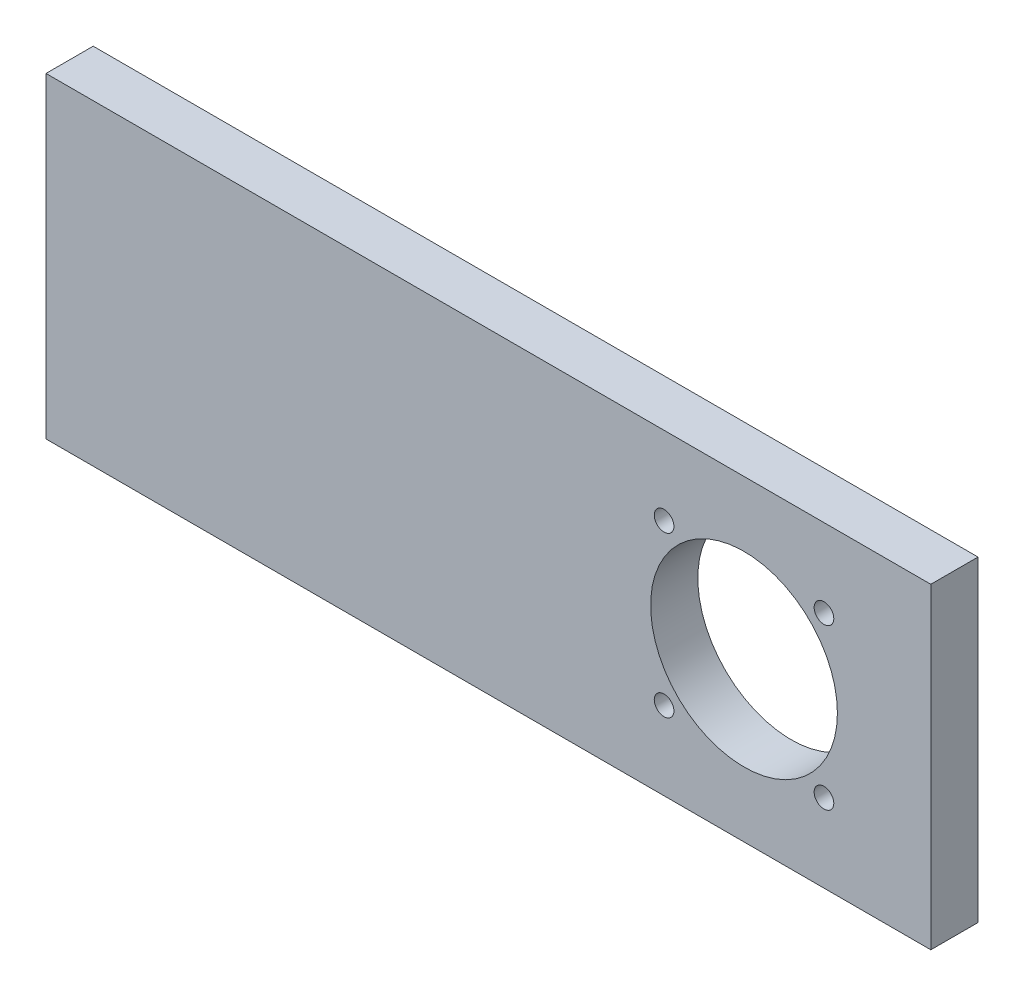
ISO-10303-21;
HEADER;
FILE_DESCRIPTION(('STEP AP214'),'2;1');
FILE_NAME('part.step','',(''),(''),'','','');
FILE_SCHEMA(('AUTOMOTIVE_DESIGN { 1 0 10303 214 1 1 1 1 }'));
ENDSEC;
DATA;
#1=APPLICATION_CONTEXT('core data for automotive mechanical design processes');
#2=APPLICATION_PROTOCOL_DEFINITION('international standard','automotive_design',2000,#1);
#3=PRODUCT_CONTEXT('',#1,'mechanical');
#4=PRODUCT('Part','Part','',(#3));
#5=PRODUCT_RELATED_PRODUCT_CATEGORY('part','',(#4));
#6=PRODUCT_DEFINITION_FORMATION('','',#4);
#7=PRODUCT_DEFINITION_CONTEXT('part definition',#1,'design');
#8=PRODUCT_DEFINITION('design','',#6,#7);
#9=PRODUCT_DEFINITION_SHAPE('','',#8);
#10=(LENGTH_UNIT() NAMED_UNIT(*) SI_UNIT(.MILLI.,.METRE.));
#11=(NAMED_UNIT(*) PLANE_ANGLE_UNIT() SI_UNIT($,.RADIAN.));
#12=(NAMED_UNIT(*) SI_UNIT($,.STERADIAN.) SOLID_ANGLE_UNIT());
#13=UNCERTAINTY_MEASURE_WITH_UNIT(LENGTH_MEASURE(1.E-05),#10,'distance_accuracy_value','');
#14=(GEOMETRIC_REPRESENTATION_CONTEXT(3) GLOBAL_UNCERTAINTY_ASSIGNED_CONTEXT((#13)) GLOBAL_UNIT_ASSIGNED_CONTEXT((#10,
#11,#12)) REPRESENTATION_CONTEXT('',''));
#15=CARTESIAN_POINT('',(0.,0.,0.));
#16=DIRECTION('',(0.,0.,1.));
#17=DIRECTION('',(1.,0.,0.));
#18=AXIS2_PLACEMENT_3D('',#15,#16,#17);
#19=CARTESIAN_POINT('',(0.,0.,24.));
#20=DIRECTION('',(0.,0.,-1.));
#21=DIRECTION('',(-1.,0.,0.));
#22=AXIS2_PLACEMENT_3D('',#19,#20,#21);
#23=PLANE('',#22);
#24=CARTESIAN_POINT('',(89.3413600817735,-40.6586399182264,24.));
#25=DIRECTION('',(0.,0.,-1.));
#26=DIRECTION('',(-1.,0.,0.));
#27=AXIS2_PLACEMENT_3D('',#24,#25,#26);
#28=CIRCLE('',#27,5.00000000000003);
#29=CARTESIAN_POINT('',(84.3413600817734,-40.6586399182264,24.));
#30=VERTEX_POINT('',#29);
#31=EDGE_CURVE('E181',#30,#30,#28,.T.);
#32=ORIENTED_EDGE('',*,*,#31,.T.);
#33=EDGE_LOOP('',(#32));
#34=FACE_BOUND('',#33,.T.);
#35=CARTESIAN_POINT('',(170.658639918226,-40.6586399182266,24.));
#36=DIRECTION('',(0.,0.,-1.));
#37=DIRECTION('',(-1.,0.,0.));
#38=AXIS2_PLACEMENT_3D('',#35,#36,#37);
#39=CIRCLE('',#38,5.00000000000002);
#40=CARTESIAN_POINT('',(165.658639918226,-40.6586399182266,24.));
#41=VERTEX_POINT('',#40);
#42=EDGE_CURVE('E186',#41,#41,#39,.T.);
#43=ORIENTED_EDGE('',*,*,#42,.T.);
#44=EDGE_LOOP('',(#43));
#45=FACE_BOUND('',#44,.T.);
#46=CARTESIAN_POINT('',(170.658639918227,40.6586399182264,24.));
#47=DIRECTION('',(0.,0.,-1.));
#48=DIRECTION('',(-1.,0.,0.));
#49=AXIS2_PLACEMENT_3D('',#46,#47,#48);
#50=CIRCLE('',#49,4.99999999999999);
#51=CARTESIAN_POINT('',(165.658639918227,40.6586399182264,24.));
#52=VERTEX_POINT('',#51);
#53=EDGE_CURVE('E176',#52,#52,#50,.T.);
#54=ORIENTED_EDGE('',*,*,#53,.T.);
#55=EDGE_LOOP('',(#54));
#56=FACE_BOUND('',#55,.T.);
#57=CARTESIAN_POINT('',(89.3413600817736,40.6586399182265,24.));
#58=DIRECTION('',(0.,0.,-1.));
#59=DIRECTION('',(-1.,0.,0.));
#60=AXIS2_PLACEMENT_3D('',#57,#58,#59);
#61=CIRCLE('',#60,5.00000000000003);
#62=CARTESIAN_POINT('',(84.3413600817736,40.6586399182265,24.));
#63=VERTEX_POINT('',#62);
#64=EDGE_CURVE('E172',#63,#63,#61,.T.);
#65=ORIENTED_EDGE('',*,*,#64,.T.);
#66=EDGE_LOOP('',(#65));
#67=FACE_BOUND('',#66,.T.);
#68=DIRECTION('',(1.,0.,0.));
#69=VECTOR('',#68,1.);
#70=CARTESIAN_POINT('',(-225.,80.5,24.));
#71=LINE('',#70,#69);
#72=CARTESIAN_POINT('',(-225.,80.5,24.));
#73=VERTEX_POINT('',#72);
#74=CARTESIAN_POINT('',(225.,80.5,24.));
#75=VERTEX_POINT('',#74);
#76=EDGE_CURVE('E115',#73,#75,#71,.T.);
#77=ORIENTED_EDGE('',*,*,#76,.F.);
#78=DIRECTION('',(0.,-1.,0.));
#79=VECTOR('',#78,1.);
#80=CARTESIAN_POINT('',(-225.,80.5,24.));
#81=LINE('',#80,#79);
#82=CARTESIAN_POINT('',(-225.,-80.5,24.));
#83=VERTEX_POINT('',#82);
#84=EDGE_CURVE('E105',#73,#83,#81,.T.);
#85=ORIENTED_EDGE('',*,*,#84,.T.);
#86=DIRECTION('',(1.,0.,0.));
#87=VECTOR('',#86,1.);
#88=CARTESIAN_POINT('',(-225.,-80.5,24.));
#89=LINE('',#88,#87);
#90=CARTESIAN_POINT('',(225.,-80.5,24.));
#91=VERTEX_POINT('',#90);
#92=EDGE_CURVE('E100',#83,#91,#89,.T.);
#93=ORIENTED_EDGE('',*,*,#92,.T.);
#94=DIRECTION('',(0.,-1.,0.));
#95=VECTOR('',#94,1.);
#96=CARTESIAN_POINT('',(225.,80.5,24.));
#97=LINE('',#96,#95);
#98=EDGE_CURVE('E104',#75,#91,#97,.T.);
#99=ORIENTED_EDGE('',*,*,#98,.F.);
#100=EDGE_LOOP('',(#77,#85,#93,#99));
#101=FACE_BOUND('',#100,.T.);
#102=CARTESIAN_POINT('',(130.,0.,24.));
#103=DIRECTION('',(0.,0.,1.));
#104=DIRECTION('',(1.,0.,0.));
#105=AXIS2_PLACEMENT_3D('',#102,#103,#104);
#106=CIRCLE('',#105,47.5);
#107=CARTESIAN_POINT('',(177.5,0.,24.));
#108=VERTEX_POINT('',#107);
#109=EDGE_CURVE('E125',#108,#108,#106,.T.);
#110=ORIENTED_EDGE('',*,*,#109,.F.);
#111=EDGE_LOOP('',(#110));
#112=FACE_BOUND('',#111,.T.);
#113=ADVANCED_FACE('F54',(#34,#45,#56,#67,#101,#112),#23,.F.);
#114=CARTESIAN_POINT('',(0.,0.,0.));
#115=DIRECTION('',(0.,0.,-1.));
#116=DIRECTION('',(-1.,0.,0.));
#117=AXIS2_PLACEMENT_3D('',#114,#115,#116);
#118=PLANE('',#117);
#119=DIRECTION('',(1.,0.,0.));
#120=VECTOR('',#119,1.);
#121=CARTESIAN_POINT('',(-225.,80.5,0.));
#122=LINE('',#121,#120);
#123=CARTESIAN_POINT('',(-225.,80.5,0.));
#124=VERTEX_POINT('',#123);
#125=CARTESIAN_POINT('',(225.,80.5,0.));
#126=VERTEX_POINT('',#125);
#127=EDGE_CURVE('E121',#124,#126,#122,.T.);
#128=ORIENTED_EDGE('',*,*,#127,.T.);
#129=DIRECTION('',(0.,-1.,0.));
#130=VECTOR('',#129,1.);
#131=CARTESIAN_POINT('',(225.,80.5,0.));
#132=LINE('',#131,#130);
#133=CARTESIAN_POINT('',(225.,-80.5,0.));
#134=VERTEX_POINT('',#133);
#135=EDGE_CURVE('E124',#126,#134,#132,.T.);
#136=ORIENTED_EDGE('',*,*,#135,.T.);
#137=DIRECTION('',(1.,0.,0.));
#138=VECTOR('',#137,1.);
#139=CARTESIAN_POINT('',(-225.,-80.5,0.));
#140=LINE('',#139,#138);
#141=CARTESIAN_POINT('',(-225.,-80.5,0.));
#142=VERTEX_POINT('',#141);
#143=EDGE_CURVE('E112',#142,#134,#140,.T.);
#144=ORIENTED_EDGE('',*,*,#143,.F.);
#145=DIRECTION('',(0.,-1.,0.));
#146=VECTOR('',#145,1.);
#147=CARTESIAN_POINT('',(-225.,80.5,0.));
#148=LINE('',#147,#146);
#149=EDGE_CURVE('E88',#124,#142,#148,.T.);
#150=ORIENTED_EDGE('',*,*,#149,.F.);
#151=EDGE_LOOP('',(#128,#136,#144,#150));
#152=FACE_BOUND('',#151,.T.);
#153=CARTESIAN_POINT('',(130.,0.,0.));
#154=DIRECTION('',(0.,0.,1.));
#155=DIRECTION('',(1.,0.,0.));
#156=AXIS2_PLACEMENT_3D('',#153,#154,#155);
#157=CIRCLE('',#156,47.5);
#158=CARTESIAN_POINT('',(177.5,0.,0.));
#159=VERTEX_POINT('',#158);
#160=EDGE_CURVE('E168',#159,#159,#157,.T.);
#161=ORIENTED_EDGE('',*,*,#160,.T.);
#162=EDGE_LOOP('',(#161));
#163=FACE_BOUND('',#162,.T.);
#164=ADVANCED_FACE('F130',(#152,#163),#118,.T.);
#165=CARTESIAN_POINT('',(-225.,80.5,24.));
#166=DIRECTION('',(0.,1.,0.));
#167=DIRECTION('',(0.,0.,1.));
#168=AXIS2_PLACEMENT_3D('',#165,#166,#167);
#169=PLANE('',#168);
#170=ORIENTED_EDGE('',*,*,#127,.F.);
#171=DIRECTION('',(0.,0.,-1.));
#172=VECTOR('',#171,1.);
#173=CARTESIAN_POINT('',(-225.,80.5,24.));
#174=LINE('',#173,#172);
#175=EDGE_CURVE('E12',#73,#124,#174,.T.);
#176=ORIENTED_EDGE('',*,*,#175,.F.);
#177=ORIENTED_EDGE('',*,*,#76,.T.);
#178=DIRECTION('',(0.,0.,-1.));
#179=VECTOR('',#178,1.);
#180=CARTESIAN_POINT('',(225.,80.5,24.));
#181=LINE('',#180,#179);
#182=EDGE_CURVE('E58',#75,#126,#181,.T.);
#183=ORIENTED_EDGE('',*,*,#182,.T.);
#184=EDGE_LOOP('',(#170,#176,#177,#183));
#185=FACE_BOUND('',#184,.T.);
#186=ADVANCED_FACE('F56',(#185),#169,.T.);
#187=CARTESIAN_POINT('',(-225.,80.5,24.));
#188=DIRECTION('',(1.,0.,0.));
#189=DIRECTION('',(0.,1.,0.));
#190=AXIS2_PLACEMENT_3D('',#187,#188,#189);
#191=PLANE('',#190);
#192=ORIENTED_EDGE('',*,*,#149,.T.);
#193=DIRECTION('',(0.,0.,-1.));
#194=VECTOR('',#193,1.);
#195=CARTESIAN_POINT('',(-225.,-80.5,24.));
#196=LINE('',#195,#194);
#197=EDGE_CURVE('E64',#83,#142,#196,.T.);
#198=ORIENTED_EDGE('',*,*,#197,.F.);
#199=ORIENTED_EDGE('',*,*,#84,.F.);
#200=ORIENTED_EDGE('',*,*,#175,.T.);
#201=EDGE_LOOP('',(#192,#198,#199,#200));
#202=FACE_BOUND('',#201,.T.);
#203=ADVANCED_FACE('F133',(#202),#191,.F.);
#204=CARTESIAN_POINT('',(-225.,-80.5,24.));
#205=DIRECTION('',(0.,1.,0.));
#206=DIRECTION('',(0.,0.,1.));
#207=AXIS2_PLACEMENT_3D('',#204,#205,#206);
#208=PLANE('',#207);
#209=ORIENTED_EDGE('',*,*,#143,.T.);
#210=DIRECTION('',(0.,0.,-1.));
#211=VECTOR('',#210,1.);
#212=CARTESIAN_POINT('',(225.,-80.5,24.));
#213=LINE('',#212,#211);
#214=EDGE_CURVE('E109',#91,#134,#213,.T.);
#215=ORIENTED_EDGE('',*,*,#214,.F.);
#216=ORIENTED_EDGE('',*,*,#92,.F.);
#217=ORIENTED_EDGE('',*,*,#197,.T.);
#218=EDGE_LOOP('',(#209,#215,#216,#217));
#219=FACE_BOUND('',#218,.T.);
#220=ADVANCED_FACE('F110',(#219),#208,.F.);
#221=CARTESIAN_POINT('',(225.,80.5,24.));
#222=DIRECTION('',(1.,0.,0.));
#223=DIRECTION('',(0.,1.,0.));
#224=AXIS2_PLACEMENT_3D('',#221,#222,#223);
#225=PLANE('',#224);
#226=ORIENTED_EDGE('',*,*,#135,.F.);
#227=ORIENTED_EDGE('',*,*,#182,.F.);
#228=ORIENTED_EDGE('',*,*,#98,.T.);
#229=ORIENTED_EDGE('',*,*,#214,.T.);
#230=EDGE_LOOP('',(#226,#227,#228,#229));
#231=FACE_BOUND('',#230,.T.);
#232=ADVANCED_FACE('F114',(#231),#225,.T.);
#233=CARTESIAN_POINT('',(130.,0.,24.));
#234=DIRECTION('',(0.,0.,-1.));
#235=DIRECTION('',(-1.,0.,0.));
#236=AXIS2_PLACEMENT_3D('',#233,#234,#235);
#237=CYLINDRICAL_SURFACE('',#236,47.5);
#238=ORIENTED_EDGE('',*,*,#109,.T.);
#239=EDGE_LOOP('',(#238));
#240=FACE_BOUND('',#239,.T.);
#241=ORIENTED_EDGE('',*,*,#160,.F.);
#242=EDGE_LOOP('',(#241));
#243=FACE_BOUND('',#242,.T.);
#244=ADVANCED_FACE('F148',(#240,#243),#237,.F.);
#245=CARTESIAN_POINT('',(89.3413600817736,40.6586399182265,6.));
#246=DIRECTION('',(0.,0.,1.));
#247=DIRECTION('',(1.,0.,0.));
#248=AXIS2_PLACEMENT_3D('',#245,#246,#247);
#249=CYLINDRICAL_SURFACE('',#248,5.00000000000003);
#250=CARTESIAN_POINT('',(89.3413600817736,40.6586399182265,6.));
#251=DIRECTION('',(0.,0.,-1.));
#252=DIRECTION('',(-1.,0.,0.));
#253=AXIS2_PLACEMENT_3D('',#250,#251,#252);
#254=CIRCLE('',#253,5.00000000000003);
#255=CARTESIAN_POINT('',(84.3413600817736,40.6586399182265,6.));
#256=VERTEX_POINT('',#255);
#257=EDGE_CURVE('E169',#256,#256,#254,.T.);
#258=ORIENTED_EDGE('',*,*,#257,.T.);
#259=EDGE_LOOP('',(#258));
#260=FACE_BOUND('',#259,.T.);
#261=ORIENTED_EDGE('',*,*,#64,.F.);
#262=EDGE_LOOP('',(#261));
#263=FACE_BOUND('',#262,.T.);
#264=ADVANCED_FACE('F156',(#260,#263),#249,.F.);
#265=CARTESIAN_POINT('',(89.3413600817736,40.6586399182265,6.));
#266=DIRECTION('',(0.,0.,-1.));
#267=DIRECTION('',(-1.,0.,0.));
#268=AXIS2_PLACEMENT_3D('',#265,#266,#267);
#269=PLANE('',#268);
#270=ORIENTED_EDGE('',*,*,#257,.F.);
#271=EDGE_LOOP('',(#270));
#272=FACE_BOUND('',#271,.T.);
#273=ADVANCED_FACE('F161',(#272),#269,.F.);
#274=CARTESIAN_POINT('',(170.658639918227,40.6586399182264,6.));
#275=DIRECTION('',(0.,0.,1.));
#276=DIRECTION('',(1.,0.,0.));
#277=AXIS2_PLACEMENT_3D('',#274,#275,#276);
#278=CYLINDRICAL_SURFACE('',#277,4.99999999999999);
#279=CARTESIAN_POINT('',(170.658639918227,40.6586399182264,6.));
#280=DIRECTION('',(0.,0.,-1.));
#281=DIRECTION('',(-1.,0.,0.));
#282=AXIS2_PLACEMENT_3D('',#279,#280,#281);
#283=CIRCLE('',#282,4.99999999999999);
#284=CARTESIAN_POINT('',(165.658639918227,40.6586399182264,6.));
#285=VERTEX_POINT('',#284);
#286=EDGE_CURVE('E189',#285,#285,#283,.T.);
#287=ORIENTED_EDGE('',*,*,#286,.T.);
#288=EDGE_LOOP('',(#287));
#289=FACE_BOUND('',#288,.T.);
#290=ORIENTED_EDGE('',*,*,#53,.F.);
#291=EDGE_LOOP('',(#290));
#292=FACE_BOUND('',#291,.T.);
#293=ADVANCED_FACE('F197',(#289,#292),#278,.F.);
#294=CARTESIAN_POINT('',(170.658639918227,40.6586399182264,6.));
#295=DIRECTION('',(0.,0.,-1.));
#296=DIRECTION('',(-1.,0.,0.));
#297=AXIS2_PLACEMENT_3D('',#294,#295,#296);
#298=PLANE('',#297);
#299=ORIENTED_EDGE('',*,*,#286,.F.);
#300=EDGE_LOOP('',(#299));
#301=FACE_BOUND('',#300,.T.);
#302=ADVANCED_FACE('F199',(#301),#298,.F.);
#303=CARTESIAN_POINT('',(170.658639918226,-40.6586399182266,6.));
#304=DIRECTION('',(0.,0.,1.));
#305=DIRECTION('',(1.,0.,0.));
#306=AXIS2_PLACEMENT_3D('',#303,#304,#305);
#307=CYLINDRICAL_SURFACE('',#306,5.00000000000002);
#308=CARTESIAN_POINT('',(170.658639918226,-40.6586399182266,6.));
#309=DIRECTION('',(0.,0.,-1.));
#310=DIRECTION('',(-1.,0.,0.));
#311=AXIS2_PLACEMENT_3D('',#308,#309,#310);
#312=CIRCLE('',#311,5.00000000000002);
#313=CARTESIAN_POINT('',(165.658639918226,-40.6586399182266,6.));
#314=VERTEX_POINT('',#313);
#315=EDGE_CURVE('E183',#314,#314,#312,.T.);
#316=ORIENTED_EDGE('',*,*,#315,.T.);
#317=EDGE_LOOP('',(#316));
#318=FACE_BOUND('',#317,.T.);
#319=ORIENTED_EDGE('',*,*,#42,.F.);
#320=EDGE_LOOP('',(#319));
#321=FACE_BOUND('',#320,.T.);
#322=ADVANCED_FACE('F206',(#318,#321),#307,.F.);
#323=CARTESIAN_POINT('',(170.658639918226,-40.6586399182266,6.));
#324=DIRECTION('',(0.,0.,-1.));
#325=DIRECTION('',(-1.,0.,0.));
#326=AXIS2_PLACEMENT_3D('',#323,#324,#325);
#327=PLANE('',#326);
#328=ORIENTED_EDGE('',*,*,#315,.F.);
#329=EDGE_LOOP('',(#328));
#330=FACE_BOUND('',#329,.T.);
#331=ADVANCED_FACE('F214',(#330),#327,.F.);
#332=CARTESIAN_POINT('',(89.3413600817735,-40.6586399182264,6.));
#333=DIRECTION('',(0.,0.,1.));
#334=DIRECTION('',(1.,0.,0.));
#335=AXIS2_PLACEMENT_3D('',#332,#333,#334);
#336=CYLINDRICAL_SURFACE('',#335,5.00000000000003);
#337=CARTESIAN_POINT('',(89.3413600817735,-40.6586399182264,6.));
#338=DIRECTION('',(0.,0.,-1.));
#339=DIRECTION('',(-1.,0.,0.));
#340=AXIS2_PLACEMENT_3D('',#337,#338,#339);
#341=CIRCLE('',#340,5.00000000000003);
#342=CARTESIAN_POINT('',(84.3413600817734,-40.6586399182264,6.));
#343=VERTEX_POINT('',#342);
#344=EDGE_CURVE('E178',#343,#343,#341,.T.);
#345=ORIENTED_EDGE('',*,*,#344,.T.);
#346=EDGE_LOOP('',(#345));
#347=FACE_BOUND('',#346,.T.);
#348=ORIENTED_EDGE('',*,*,#31,.F.);
#349=EDGE_LOOP('',(#348));
#350=FACE_BOUND('',#349,.T.);
#351=ADVANCED_FACE('F218',(#347,#350),#336,.F.);
#352=CARTESIAN_POINT('',(89.3413600817735,-40.6586399182264,6.));
#353=DIRECTION('',(0.,0.,-1.));
#354=DIRECTION('',(-1.,0.,0.));
#355=AXIS2_PLACEMENT_3D('',#352,#353,#354);
#356=PLANE('',#355);
#357=ORIENTED_EDGE('',*,*,#344,.F.);
#358=EDGE_LOOP('',(#357));
#359=FACE_BOUND('',#358,.T.);
#360=ADVANCED_FACE('F222',(#359),#356,.F.);
#361=CLOSED_SHELL('',(#113,#164,#186,#203,#220,#232,#244,#264,#273,#293,#302,#322,#331,#351,#360));
#362=MANIFOLD_SOLID_BREP('B2',#361);
#363=ADVANCED_BREP_SHAPE_REPRESENTATION('',(#18,#362),#14);
#364=SHAPE_DEFINITION_REPRESENTATION(#9,#363);
ENDSEC;
END-ISO-10303-21;
